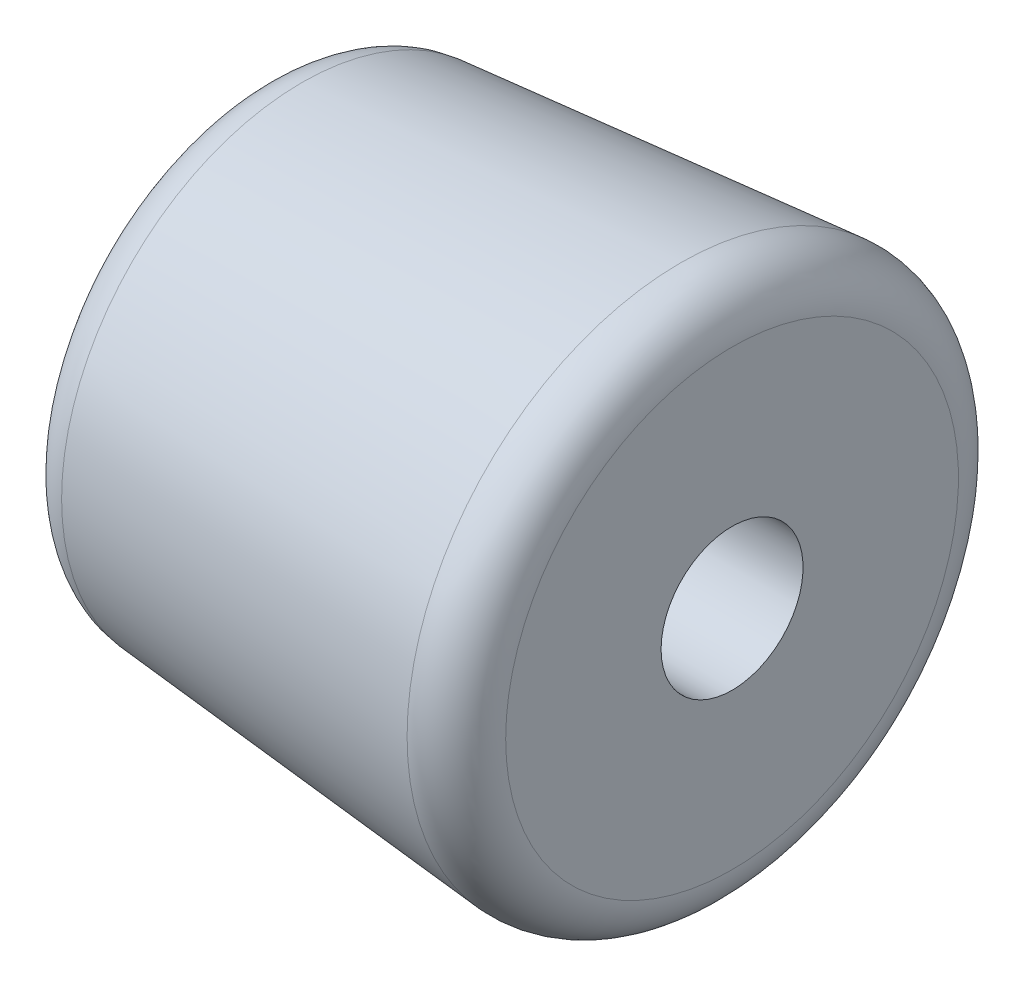
ISO-10303-21;
HEADER;
FILE_DESCRIPTION(('STEP AP214'),'2;1');
FILE_NAME('part.step','',(''),(''),'','','');
FILE_SCHEMA(('AUTOMOTIVE_DESIGN { 1 0 10303 214 1 1 1 1 }'));
ENDSEC;
DATA;
#1=APPLICATION_CONTEXT('core data for automotive mechanical design processes');
#2=APPLICATION_PROTOCOL_DEFINITION('international standard','automotive_design',2000,#1);
#3=PRODUCT_CONTEXT('',#1,'mechanical');
#4=PRODUCT('Part','Part','',(#3));
#5=PRODUCT_RELATED_PRODUCT_CATEGORY('part','',(#4));
#6=PRODUCT_DEFINITION_FORMATION('','',#4);
#7=PRODUCT_DEFINITION_CONTEXT('part definition',#1,'design');
#8=PRODUCT_DEFINITION('design','',#6,#7);
#9=PRODUCT_DEFINITION_SHAPE('','',#8);
#10=(LENGTH_UNIT() NAMED_UNIT(*) SI_UNIT(.MILLI.,.METRE.));
#11=(NAMED_UNIT(*) PLANE_ANGLE_UNIT() SI_UNIT($,.RADIAN.));
#12=(NAMED_UNIT(*) SI_UNIT($,.STERADIAN.) SOLID_ANGLE_UNIT());
#13=UNCERTAINTY_MEASURE_WITH_UNIT(LENGTH_MEASURE(1.E-05),#10,'distance_accuracy_value','');
#14=(GEOMETRIC_REPRESENTATION_CONTEXT(3) GLOBAL_UNCERTAINTY_ASSIGNED_CONTEXT((#13)) GLOBAL_UNIT_ASSIGNED_CONTEXT((#10,
#11,#12)) REPRESENTATION_CONTEXT('',''));
#15=CARTESIAN_POINT('',(0.,0.,0.));
#16=DIRECTION('',(0.,0.,1.));
#17=DIRECTION('',(1.,0.,0.));
#18=AXIS2_PLACEMENT_3D('',#15,#16,#17);
#19=CARTESIAN_POINT('',(0.,0.,0.));
#20=DIRECTION('',(-1.,0.,0.));
#21=DIRECTION('',(0.,0.,1.));
#22=AXIS2_PLACEMENT_3D('',#19,#20,#21);
#23=CYLINDRICAL_SURFACE('',#22,3.);
#24=CARTESIAN_POINT('',(20.,0.,0.));
#25=DIRECTION('',(-1.,0.,0.));
#26=DIRECTION('',(0.,0.,1.));
#27=AXIS2_PLACEMENT_3D('',#24,#25,#26);
#28=CIRCLE('',#27,3.);
#29=CARTESIAN_POINT('',(20.,0.,3.));
#30=VERTEX_POINT('',#29);
#31=EDGE_CURVE('E54',#30,#30,#28,.T.);
#32=ORIENTED_EDGE('',*,*,#31,.F.);
#33=EDGE_LOOP('',(#32));
#34=FACE_BOUND('',#33,.T.);
#35=CARTESIAN_POINT('',(0.,0.,0.));
#36=DIRECTION('',(-1.,0.,0.));
#37=DIRECTION('',(0.,0.,1.));
#38=AXIS2_PLACEMENT_3D('',#35,#36,#37);
#39=CIRCLE('',#38,2.99999999999999);
#40=CARTESIAN_POINT('',(0.,0.,2.99999999999999));
#41=VERTEX_POINT('',#40);
#42=EDGE_CURVE('E51',#41,#41,#39,.T.);
#43=ORIENTED_EDGE('',*,*,#42,.T.);
#44=EDGE_LOOP('',(#43));
#45=FACE_BOUND('',#44,.T.);
#46=ADVANCED_FACE('F31',(#34,#45),#23,.F.);
#47=CARTESIAN_POINT('',(0.,2.99999999999999,0.));
#48=DIRECTION('',(1.,0.,0.));
#49=DIRECTION('',(0.,0.,-1.));
#50=AXIS2_PLACEMENT_3D('',#47,#48,#49);
#51=PLANE('',#50);
#52=CARTESIAN_POINT('',(0.,0.,0.));
#53=DIRECTION('',(1.,0.,0.));
#54=DIRECTION('',(0.,0.,-1.));
#55=AXIS2_PLACEMENT_3D('',#52,#53,#54);
#56=CIRCLE('',#55,8.16733765196514);
#57=CARTESIAN_POINT('',(0.,0.,-8.16733765196514));
#58=VERTEX_POINT('',#57);
#59=EDGE_CURVE('E46',#58,#58,#56,.F.);
#60=ORIENTED_EDGE('',*,*,#59,.T.);
#61=EDGE_LOOP('',(#60));
#62=FACE_BOUND('',#61,.T.);
#63=ORIENTED_EDGE('',*,*,#42,.F.);
#64=EDGE_LOOP('',(#63));
#65=FACE_BOUND('',#64,.T.);
#66=ADVANCED_FACE('F62',(#62,#65),#51,.F.);
#67=CARTESIAN_POINT('',(20.,0.,0.));
#68=DIRECTION('',(1.,0.,0.));
#69=DIRECTION('',(0.,0.,-1.));
#70=AXIS2_PLACEMENT_3D('',#67,#68,#69);
#71=CONICAL_SURFACE('',#70,11.7497732705183,0.08726646259971);
#72=CARTESIAN_POINT('',(1.82568851450468,0.,0.));
#73=DIRECTION('',(-1.,0.,0.));
#74=DIRECTION('',(0.,0.,1.));
#75=AXIS2_PLACEMENT_3D('',#72,#73,#74);
#76=CIRCLE('',#75,10.1597270481486);
#77=CARTESIAN_POINT('',(1.82568851450468,0.,10.1597270481486));
#78=VERTEX_POINT('',#77);
#79=EDGE_CURVE('E38',#78,#78,#76,.F.);
#80=ORIENTED_EDGE('',*,*,#79,.T.);
#81=EDGE_LOOP('',(#80));
#82=FACE_BOUND('',#81,.T.);
#83=CARTESIAN_POINT('',(17.8256885145047,0.,0.));
#84=DIRECTION('',(-1.,0.,0.));
#85=DIRECTION('',(0.,0.,1.));
#86=AXIS2_PLACEMENT_3D('',#83,#84,#85);
#87=CIRCLE('',#86,11.5595456645633);
#88=CARTESIAN_POINT('',(17.8256885145047,0.,11.5595456645633));
#89=VERTEX_POINT('',#88);
#90=EDGE_CURVE('E42',#89,#89,#87,.T.);
#91=ORIENTED_EDGE('',*,*,#90,.T.);
#92=EDGE_LOOP('',(#91));
#93=FACE_BOUND('',#92,.T.);
#94=ADVANCED_FACE('F67',(#82,#93),#71,.T.);
#95=CARTESIAN_POINT('',(20.,11.7497732705183,0.));
#96=DIRECTION('',(-1.,0.,0.));
#97=DIRECTION('',(0.,0.,1.));
#98=AXIS2_PLACEMENT_3D('',#95,#96,#97);
#99=PLANE('',#98);
#100=CARTESIAN_POINT('',(20.,0.,0.));
#101=DIRECTION('',(-1.,0.,0.));
#102=DIRECTION('',(0.,0.,1.));
#103=AXIS2_PLACEMENT_3D('',#100,#101,#102);
#104=CIRCLE('',#103,9.56715626837982);
#105=CARTESIAN_POINT('',(20.,0.,9.56715626837982));
#106=VERTEX_POINT('',#105);
#107=EDGE_CURVE('E10',#106,#106,#104,.F.);
#108=ORIENTED_EDGE('',*,*,#107,.T.);
#109=EDGE_LOOP('',(#108));
#110=FACE_BOUND('',#109,.T.);
#111=ORIENTED_EDGE('',*,*,#31,.T.);
#112=EDGE_LOOP('',(#111));
#113=FACE_BOUND('',#112,.T.);
#114=ADVANCED_FACE('F58',(#110,#113),#99,.F.);
#115=CARTESIAN_POINT('',(2.,0.,0.));
#116=DIRECTION('',(1.,0.,0.));
#117=DIRECTION('',(0.,0.,-1.));
#118=AXIS2_PLACEMENT_3D('',#115,#116,#117);
#119=TOROIDAL_SURFACE('',#118,8.16733765196514,2.);
#120=ORIENTED_EDGE('',*,*,#79,.F.);
#121=EDGE_LOOP('',(#120));
#122=FACE_BOUND('',#121,.T.);
#123=ORIENTED_EDGE('',*,*,#59,.F.);
#124=EDGE_LOOP('',(#123));
#125=FACE_BOUND('',#124,.T.);
#126=ADVANCED_FACE('F75',(#122,#125),#119,.T.);
#127=CARTESIAN_POINT('',(18.,0.,0.));
#128=DIRECTION('',(-1.,0.,0.));
#129=DIRECTION('',(0.,0.,1.));
#130=AXIS2_PLACEMENT_3D('',#127,#128,#129);
#131=TOROIDAL_SURFACE('',#130,9.56715626837982,2.);
#132=ORIENTED_EDGE('',*,*,#107,.F.);
#133=EDGE_LOOP('',(#132));
#134=FACE_BOUND('',#133,.T.);
#135=ORIENTED_EDGE('',*,*,#90,.F.);
#136=EDGE_LOOP('',(#135));
#137=FACE_BOUND('',#136,.T.);
#138=ADVANCED_FACE('F33',(#134,#137),#131,.T.);
#139=CLOSED_SHELL('',(#46,#66,#94,#114,#126,#138));
#140=MANIFOLD_SOLID_BREP('B2',#139);
#141=ADVANCED_BREP_SHAPE_REPRESENTATION('',(#18,#140),#14);
#142=SHAPE_DEFINITION_REPRESENTATION(#9,#141);
ENDSEC;
END-ISO-10303-21;
